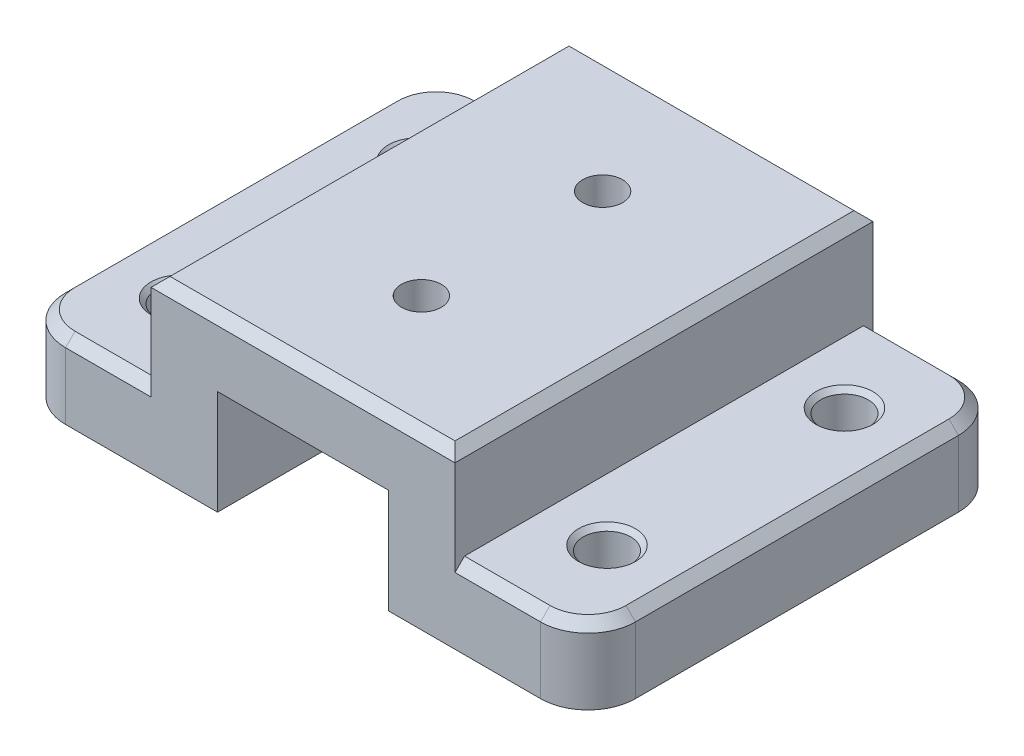
ISO-10303-21;
HEADER;
FILE_DESCRIPTION(('STEP AP214'),'2;1');
FILE_NAME('part.step','',(''),(''),'','','');
FILE_SCHEMA(('AUTOMOTIVE_DESIGN { 1 0 10303 214 1 1 1 1 }'));
ENDSEC;
DATA;
#1=APPLICATION_CONTEXT('core data for automotive mechanical design processes');
#2=APPLICATION_PROTOCOL_DEFINITION('international standard','automotive_design',2000,#1);
#3=PRODUCT_CONTEXT('',#1,'mechanical');
#4=PRODUCT('Part','Part','',(#3));
#5=PRODUCT_RELATED_PRODUCT_CATEGORY('part','',(#4));
#6=PRODUCT_DEFINITION_FORMATION('','',#4);
#7=PRODUCT_DEFINITION_CONTEXT('part definition',#1,'design');
#8=PRODUCT_DEFINITION('design','',#6,#7);
#9=PRODUCT_DEFINITION_SHAPE('','',#8);
#10=(LENGTH_UNIT() NAMED_UNIT(*) SI_UNIT(.MILLI.,.METRE.));
#11=(NAMED_UNIT(*) PLANE_ANGLE_UNIT() SI_UNIT($,.RADIAN.));
#12=(NAMED_UNIT(*) SI_UNIT($,.STERADIAN.) SOLID_ANGLE_UNIT());
#13=UNCERTAINTY_MEASURE_WITH_UNIT(LENGTH_MEASURE(1.E-05),#10,'distance_accuracy_value','');
#14=(GEOMETRIC_REPRESENTATION_CONTEXT(3) GLOBAL_UNCERTAINTY_ASSIGNED_CONTEXT((#13)) GLOBAL_UNIT_ASSIGNED_CONTEXT((#10,
#11,#12)) REPRESENTATION_CONTEXT('',''));
#15=CARTESIAN_POINT('',(0.,0.,0.));
#16=DIRECTION('',(0.,0.,1.));
#17=DIRECTION('',(1.,0.,0.));
#18=AXIS2_PLACEMENT_3D('',#15,#16,#17);
#19=CARTESIAN_POINT('',(-9.,11.,-22.));
#20=DIRECTION('',(1.,0.,0.));
#21=DIRECTION('',(0.,0.,-1.));
#22=AXIS2_PLACEMENT_3D('',#19,#20,#21);
#23=PLANE('',#22);
#24=DIRECTION('',(0.,1.,0.));
#25=VECTOR('',#24,1.);
#26=CARTESIAN_POINT('',(-9.,11.,22.));
#27=LINE('',#26,#25);
#28=CARTESIAN_POINT('',(-9.,0.,22.));
#29=VERTEX_POINT('',#28);
#30=CARTESIAN_POINT('',(-9.,11.,22.));
#31=VERTEX_POINT('',#30);
#32=EDGE_CURVE('E249',#29,#31,#27,.T.);
#33=ORIENTED_EDGE('',*,*,#32,.F.);
#34=DIRECTION('',(0.,0.,1.));
#35=VECTOR('',#34,1.);
#36=CARTESIAN_POINT('',(-9.,0.,-22.));
#37=LINE('',#36,#35);
#38=CARTESIAN_POINT('',(-9.,0.,-22.));
#39=VERTEX_POINT('',#38);
#40=EDGE_CURVE('E230',#39,#29,#37,.T.);
#41=ORIENTED_EDGE('',*,*,#40,.F.);
#42=DIRECTION('',(0.,1.,0.));
#43=VECTOR('',#42,1.);
#44=CARTESIAN_POINT('',(-9.,11.,-22.));
#45=LINE('',#44,#43);
#46=CARTESIAN_POINT('',(-9.,11.,-22.));
#47=VERTEX_POINT('',#46);
#48=EDGE_CURVE('E223',#39,#47,#45,.T.);
#49=ORIENTED_EDGE('',*,*,#48,.T.);
#50=DIRECTION('',(0.,0.,1.));
#51=VECTOR('',#50,1.);
#52=CARTESIAN_POINT('',(-9.,11.,-22.));
#53=LINE('',#52,#51);
#54=EDGE_CURVE('E204',#47,#31,#53,.T.);
#55=ORIENTED_EDGE('',*,*,#54,.T.);
#56=EDGE_LOOP('',(#33,#41,#49,#55));
#57=FACE_BOUND('',#56,.T.);
#58=ADVANCED_FACE('F40',(#57),#23,.T.);
#59=CARTESIAN_POINT('',(-9.,0.,-22.));
#60=DIRECTION('',(0.,-1.,0.));
#61=DIRECTION('',(1.,0.,0.));
#62=AXIS2_PLACEMENT_3D('',#59,#60,#61);
#63=PLANE('',#62);
#64=CARTESIAN_POINT('',(-22.5,0.,12.5));
#65=DIRECTION('',(0.,1.,0.));
#66=DIRECTION('',(1.,0.,0.));
#67=AXIS2_PLACEMENT_3D('',#64,#65,#66);
#68=CIRCLE('',#67,2.5);
#69=CARTESIAN_POINT('',(-20.,0.,12.5));
#70=VERTEX_POINT('',#69);
#71=EDGE_CURVE('E935',#70,#70,#68,.T.);
#72=ORIENTED_EDGE('',*,*,#71,.T.);
#73=EDGE_LOOP('',(#72));
#74=FACE_BOUND('',#73,.T.);
#75=CARTESIAN_POINT('',(-22.5,0.,-12.5));
#76=DIRECTION('',(0.,-1.,0.));
#77=DIRECTION('',(1.,0.,0.));
#78=AXIS2_PLACEMENT_3D('',#75,#76,#77);
#79=CIRCLE('',#78,2.5);
#80=CARTESIAN_POINT('',(-20.,0.,-12.5));
#81=VERTEX_POINT('',#80);
#82=EDGE_CURVE('E940',#81,#81,#79,.T.);
#83=ORIENTED_EDGE('',*,*,#82,.F.);
#84=EDGE_LOOP('',(#83));
#85=FACE_BOUND('',#84,.T.);
#86=DIRECTION('',(0.,0.,1.));
#87=VECTOR('',#86,1.);
#88=CARTESIAN_POINT('',(-30.,0.,-22.));
#89=LINE('',#88,#87);
#90=CARTESIAN_POINT('',(-30.,0.,-17.));
#91=VERTEX_POINT('',#90);
#92=CARTESIAN_POINT('',(-30.,0.,17.));
#93=VERTEX_POINT('',#92);
#94=EDGE_CURVE('E265',#91,#93,#89,.T.);
#95=ORIENTED_EDGE('',*,*,#94,.F.);
#96=CARTESIAN_POINT('',(-25.,0.,-17.));
#97=DIRECTION('',(0.,-1.,0.));
#98=DIRECTION('',(1.,0.,0.));
#99=AXIS2_PLACEMENT_3D('',#96,#97,#98);
#100=CIRCLE('',#99,5.);
#101=CARTESIAN_POINT('',(-25.,0.,-22.));
#102=VERTEX_POINT('',#101);
#103=EDGE_CURVE('E286',#91,#102,#100,.T.);
#104=ORIENTED_EDGE('',*,*,#103,.T.);
#105=DIRECTION('',(1.,0.,0.));
#106=VECTOR('',#105,1.);
#107=CARTESIAN_POINT('',(-9.,0.,-22.));
#108=LINE('',#107,#106);
#109=EDGE_CURVE('E215',#102,#39,#108,.T.);
#110=ORIENTED_EDGE('',*,*,#109,.T.);
#111=ORIENTED_EDGE('',*,*,#40,.T.);
#112=DIRECTION('',(1.,0.,0.));
#113=VECTOR('',#112,1.);
#114=CARTESIAN_POINT('',(-9.,0.,22.));
#115=LINE('',#114,#113);
#116=CARTESIAN_POINT('',(-25.,0.,22.));
#117=VERTEX_POINT('',#116);
#118=EDGE_CURVE('E231',#117,#29,#115,.T.);
#119=ORIENTED_EDGE('',*,*,#118,.F.);
#120=CARTESIAN_POINT('',(-25.,0.,17.));
#121=DIRECTION('',(0.,-1.,0.));
#122=DIRECTION('',(1.,0.,0.));
#123=AXIS2_PLACEMENT_3D('',#120,#121,#122);
#124=CIRCLE('',#123,5.);
#125=EDGE_CURVE('E284',#117,#93,#124,.T.);
#126=ORIENTED_EDGE('',*,*,#125,.T.);
#127=EDGE_LOOP('',(#95,#104,#110,#111,#119,#126));
#128=FACE_BOUND('',#127,.T.);
#129=ADVANCED_FACE('F542',(#74,#85,#128),#63,.T.);
#130=CARTESIAN_POINT('',(-30.,0.,-22.));
#131=DIRECTION('',(-1.,0.,0.));
#132=DIRECTION('',(0.,-1.,0.));
#133=AXIS2_PLACEMENT_3D('',#130,#131,#132);
#134=PLANE('',#133);
#135=DIRECTION('',(0.,-1.,0.));
#136=VECTOR('',#135,1.);
#137=CARTESIAN_POINT('',(-30.,7.99999999999999,17.));
#138=LINE('',#137,#136);
#139=CARTESIAN_POINT('',(-30.,6.99999999999999,17.));
#140=VERTEX_POINT('',#139);
#141=EDGE_CURVE('E264',#93,#140,#138,.F.);
#142=ORIENTED_EDGE('',*,*,#141,.T.);
#143=DIRECTION('',(0.,0.,-1.));
#144=VECTOR('',#143,1.);
#145=CARTESIAN_POINT('',(-30.,6.99999999999999,-22.));
#146=LINE('',#145,#144);
#147=CARTESIAN_POINT('',(-30.,6.99999999999999,-17.));
#148=VERTEX_POINT('',#147);
#149=EDGE_CURVE('E327',#140,#148,#146,.T.);
#150=ORIENTED_EDGE('',*,*,#149,.T.);
#151=DIRECTION('',(0.,-1.,0.));
#152=VECTOR('',#151,1.);
#153=CARTESIAN_POINT('',(-30.,0.,-17.));
#154=LINE('',#153,#152);
#155=EDGE_CURVE('E282',#148,#91,#154,.T.);
#156=ORIENTED_EDGE('',*,*,#155,.T.);
#157=ORIENTED_EDGE('',*,*,#94,.T.);
#158=EDGE_LOOP('',(#142,#150,#156,#157));
#159=FACE_BOUND('',#158,.T.);
#160=ADVANCED_FACE('F440',(#159),#134,.T.);
#161=CARTESIAN_POINT('',(-30.,7.99999999999999,-22.));
#162=DIRECTION('',(0.,1.,0.));
#163=DIRECTION('',(0.,0.,1.));
#164=AXIS2_PLACEMENT_3D('',#161,#162,#163);
#165=PLANE('',#164);
#166=CARTESIAN_POINT('',(-22.5,7.99999999999999,12.5));
#167=DIRECTION('',(0.,1.,0.));
#168=DIRECTION('',(0.,0.,1.));
#169=AXIS2_PLACEMENT_3D('',#166,#167,#168);
#170=CIRCLE('',#169,2.99999999999999);
#171=CARTESIAN_POINT('',(-22.5,7.99999999999999,15.5));
#172=VERTEX_POINT('',#171);
#173=EDGE_CURVE('E422',#172,#172,#170,.F.);
#174=ORIENTED_EDGE('',*,*,#173,.T.);
#175=EDGE_LOOP('',(#174));
#176=FACE_BOUND('',#175,.T.);
#177=CARTESIAN_POINT('',(-22.5,7.99999999999999,-12.5));
#178=DIRECTION('',(0.,1.,0.));
#179=DIRECTION('',(0.,0.,1.));
#180=AXIS2_PLACEMENT_3D('',#177,#178,#179);
#181=CIRCLE('',#180,3.);
#182=CARTESIAN_POINT('',(-22.5,7.99999999999999,-9.5));
#183=VERTEX_POINT('',#182);
#184=EDGE_CURVE('E419',#183,#183,#181,.F.);
#185=ORIENTED_EDGE('',*,*,#184,.T.);
#186=EDGE_LOOP('',(#185));
#187=FACE_BOUND('',#186,.T.);
#188=DIRECTION('',(0.,0.,1.));
#189=VECTOR('',#188,1.);
#190=CARTESIAN_POINT('',(-16.,7.99999999999999,-22.));
#191=LINE('',#190,#189);
#192=CARTESIAN_POINT('',(-16.,7.99999999999999,-21.));
#193=VERTEX_POINT('',#192);
#194=CARTESIAN_POINT('',(-16.,7.99999999999999,21.));
#195=VERTEX_POINT('',#194);
#196=EDGE_CURVE('E268',#193,#195,#191,.T.);
#197=ORIENTED_EDGE('',*,*,#196,.F.);
#198=DIRECTION('',(-1.,0.,0.));
#199=VECTOR('',#198,1.);
#200=CARTESIAN_POINT('',(-30.,7.99999999999999,-21.));
#201=LINE('',#200,#199);
#202=CARTESIAN_POINT('',(-25.,7.99999999999999,-21.));
#203=VERTEX_POINT('',#202);
#204=EDGE_CURVE('E314',#193,#203,#201,.T.);
#205=ORIENTED_EDGE('',*,*,#204,.T.);
#206=CARTESIAN_POINT('',(-25.,7.99999999999999,-17.));
#207=DIRECTION('',(0.,1.,0.));
#208=DIRECTION('',(0.,0.,1.));
#209=AXIS2_PLACEMENT_3D('',#206,#207,#208);
#210=CIRCLE('',#209,3.99999999999999);
#211=CARTESIAN_POINT('',(-29.,7.99999999999999,-17.));
#212=VERTEX_POINT('',#211);
#213=EDGE_CURVE('E312',#203,#212,#210,.T.);
#214=ORIENTED_EDGE('',*,*,#213,.T.);
#215=DIRECTION('',(0.,0.,1.));
#216=VECTOR('',#215,1.);
#217=CARTESIAN_POINT('',(-29.,7.99999999999999,-22.));
#218=LINE('',#217,#216);
#219=CARTESIAN_POINT('',(-29.,7.99999999999999,17.));
#220=VERTEX_POINT('',#219);
#221=EDGE_CURVE('E310',#212,#220,#218,.T.);
#222=ORIENTED_EDGE('',*,*,#221,.T.);
#223=CARTESIAN_POINT('',(-25.,7.99999999999999,17.));
#224=DIRECTION('',(0.,1.,0.));
#225=DIRECTION('',(0.,0.,1.));
#226=AXIS2_PLACEMENT_3D('',#223,#224,#225);
#227=CIRCLE('',#226,3.99999999999999);
#228=CARTESIAN_POINT('',(-25.,7.99999999999999,21.));
#229=VERTEX_POINT('',#228);
#230=EDGE_CURVE('E308',#220,#229,#227,.T.);
#231=ORIENTED_EDGE('',*,*,#230,.T.);
#232=DIRECTION('',(1.,0.,0.));
#233=VECTOR('',#232,1.);
#234=CARTESIAN_POINT('',(-16.,7.99999999999999,21.));
#235=LINE('',#234,#233);
#236=EDGE_CURVE('E306',#229,#195,#235,.T.);
#237=ORIENTED_EDGE('',*,*,#236,.T.);
#238=EDGE_LOOP('',(#197,#205,#214,#222,#231,#237));
#239=FACE_BOUND('',#238,.T.);
#240=ADVANCED_FACE('F436',(#176,#187,#239),#165,.T.);
#241=CARTESIAN_POINT('',(-16.,7.99999999999999,-22.));
#242=DIRECTION('',(-1.,0.,0.));
#243=DIRECTION('',(0.,0.,1.));
#244=AXIS2_PLACEMENT_3D('',#241,#242,#243);
#245=PLANE('',#244);
#246=DIRECTION('',(0.,-1.,0.));
#247=VECTOR('',#246,1.);
#248=CARTESIAN_POINT('',(-16.,7.99999999999999,22.));
#249=LINE('',#248,#247);
#250=CARTESIAN_POINT('',(-16.,17.,22.));
#251=VERTEX_POINT('',#250);
#252=CARTESIAN_POINT('',(-16.,6.99999999999999,22.));
#253=VERTEX_POINT('',#252);
#254=EDGE_CURVE('E233',#251,#253,#249,.T.);
#255=ORIENTED_EDGE('',*,*,#254,.F.);
#256=DIRECTION('',(0.,0.,-1.));
#257=VECTOR('',#256,1.);
#258=CARTESIAN_POINT('',(-16.,17.,-22.));
#259=LINE('',#258,#257);
#260=CARTESIAN_POINT('',(-16.,17.,-22.));
#261=VERTEX_POINT('',#260);
#262=EDGE_CURVE('E362',#251,#261,#259,.T.);
#263=ORIENTED_EDGE('',*,*,#262,.T.);
#264=DIRECTION('',(0.,-1.,0.));
#265=VECTOR('',#264,1.);
#266=CARTESIAN_POINT('',(-16.,7.99999999999999,-22.));
#267=LINE('',#266,#265);
#268=CARTESIAN_POINT('',(-16.,6.99999999999999,-22.));
#269=VERTEX_POINT('',#268);
#270=EDGE_CURVE('E246',#261,#269,#267,.T.);
#271=ORIENTED_EDGE('',*,*,#270,.T.);
#272=DIRECTION('',(0.,-0.707106781186545,-0.70710678118655));
#273=VECTOR('',#272,1.);
#274=CARTESIAN_POINT('',(-16.,7.99999999999999,-21.));
#275=LINE('',#274,#273);
#276=EDGE_CURVE('E366',#269,#193,#275,.F.);
#277=ORIENTED_EDGE('',*,*,#276,.T.);
#278=ORIENTED_EDGE('',*,*,#196,.T.);
#279=DIRECTION('',(0.,-0.707106781186545,0.70710678118655));
#280=VECTOR('',#279,1.);
#281=CARTESIAN_POINT('',(-16.,6.99999999999999,22.));
#282=LINE('',#281,#280);
#283=EDGE_CURVE('E368',#195,#253,#282,.T.);
#284=ORIENTED_EDGE('',*,*,#283,.T.);
#285=EDGE_LOOP('',(#255,#263,#271,#277,#278,#284));
#286=FACE_BOUND('',#285,.T.);
#287=ADVANCED_FACE('F439',(#286),#245,.T.);
#288=CARTESIAN_POINT('',(-16.,18.,-22.));
#289=DIRECTION('',(0.,1.,0.));
#290=DIRECTION('',(-1.,0.,0.));
#291=AXIS2_PLACEMENT_3D('',#288,#289,#290);
#292=PLANE('',#291);
#293=CARTESIAN_POINT('',(0.,18.,9.54006420562289));
#294=DIRECTION('',(0.,1.,0.));
#295=DIRECTION('',(0.,0.,1.));
#296=AXIS2_PLACEMENT_3D('',#293,#294,#295);
#297=CIRCLE('',#296,2.1);
#298=CARTESIAN_POINT('',(0.,18.,11.6400642056229));
#299=VERTEX_POINT('',#298);
#300=EDGE_CURVE('E925',#299,#299,#297,.T.);
#301=ORIENTED_EDGE('',*,*,#300,.F.);
#302=EDGE_LOOP('',(#301));
#303=FACE_BOUND('',#302,.T.);
#304=CARTESIAN_POINT('',(0.,18.,-9.54006420562289));
#305=DIRECTION('',(0.,1.,0.));
#306=DIRECTION('',(0.,0.,1.));
#307=AXIS2_PLACEMENT_3D('',#304,#305,#306);
#308=CIRCLE('',#307,2.1);
#309=CARTESIAN_POINT('',(0.,18.,-7.44006420562289));
#310=VERTEX_POINT('',#309);
#311=EDGE_CURVE('E927',#310,#310,#308,.T.);
#312=ORIENTED_EDGE('',*,*,#311,.F.);
#313=EDGE_LOOP('',(#312));
#314=FACE_BOUND('',#313,.T.);
#315=DIRECTION('',(0.,0.,-1.));
#316=VECTOR('',#315,1.);
#317=CARTESIAN_POINT('',(15.,18.,-22.));
#318=LINE('',#317,#316);
#319=CARTESIAN_POINT('',(15.,18.,21.));
#320=VERTEX_POINT('',#319);
#321=CARTESIAN_POINT('',(15.,18.,-21.));
#322=VERTEX_POINT('',#321);
#323=EDGE_CURVE('E355',#320,#322,#318,.T.);
#324=ORIENTED_EDGE('',*,*,#323,.T.);
#325=DIRECTION('',(-1.,0.,0.));
#326=VECTOR('',#325,1.);
#327=CARTESIAN_POINT('',(-16.,18.,-21.));
#328=LINE('',#327,#326);
#329=CARTESIAN_POINT('',(-15.,18.,-21.));
#330=VERTEX_POINT('',#329);
#331=EDGE_CURVE('E360',#322,#330,#328,.T.);
#332=ORIENTED_EDGE('',*,*,#331,.T.);
#333=DIRECTION('',(0.,0.,1.));
#334=VECTOR('',#333,1.);
#335=CARTESIAN_POINT('',(-15.,18.,-22.));
#336=LINE('',#335,#334);
#337=CARTESIAN_POINT('',(-15.,18.,21.));
#338=VERTEX_POINT('',#337);
#339=EDGE_CURVE('E63',#330,#338,#336,.T.);
#340=ORIENTED_EDGE('',*,*,#339,.T.);
#341=DIRECTION('',(1.,0.,0.));
#342=VECTOR('',#341,1.);
#343=CARTESIAN_POINT('',(16.,18.,21.));
#344=LINE('',#343,#342);
#345=EDGE_CURVE('E357',#338,#320,#344,.T.);
#346=ORIENTED_EDGE('',*,*,#345,.T.);
#347=EDGE_LOOP('',(#324,#332,#340,#346));
#348=FACE_BOUND('',#347,.T.);
#349=ADVANCED_FACE('F482',(#303,#314,#348),#292,.T.);
#350=CARTESIAN_POINT('',(16.,8.,-22.));
#351=DIRECTION('',(1.,0.,0.));
#352=DIRECTION('',(0.,0.,-1.));
#353=AXIS2_PLACEMENT_3D('',#350,#351,#352);
#354=PLANE('',#353);
#355=DIRECTION('',(0.,1.,0.));
#356=VECTOR('',#355,1.);
#357=CARTESIAN_POINT('',(16.,8.,-22.));
#358=LINE('',#357,#356);
#359=CARTESIAN_POINT('',(16.,6.99999999999999,-22.));
#360=VERTEX_POINT('',#359);
#361=CARTESIAN_POINT('',(16.,17.,-22.));
#362=VERTEX_POINT('',#361);
#363=EDGE_CURVE('E243',#360,#362,#358,.T.);
#364=ORIENTED_EDGE('',*,*,#363,.T.);
#365=DIRECTION('',(0.,0.,1.));
#366=VECTOR('',#365,1.);
#367=CARTESIAN_POINT('',(16.,17.,-22.));
#368=LINE('',#367,#366);
#369=CARTESIAN_POINT('',(16.,17.,22.));
#370=VERTEX_POINT('',#369);
#371=EDGE_CURVE('E364',#362,#370,#368,.T.);
#372=ORIENTED_EDGE('',*,*,#371,.T.);
#373=DIRECTION('',(0.,1.,0.));
#374=VECTOR('',#373,1.);
#375=CARTESIAN_POINT('',(16.,8.,22.));
#376=LINE('',#375,#374);
#377=CARTESIAN_POINT('',(16.,7.,22.));
#378=VERTEX_POINT('',#377);
#379=EDGE_CURVE('E259',#378,#370,#376,.T.);
#380=ORIENTED_EDGE('',*,*,#379,.F.);
#381=DIRECTION('',(0.,0.707106781186545,-0.70710678118655));
#382=VECTOR('',#381,1.);
#383=CARTESIAN_POINT('',(16.,6.99999999999999,22.));
#384=LINE('',#383,#382);
#385=CARTESIAN_POINT('',(16.,8.,21.));
#386=VERTEX_POINT('',#385);
#387=EDGE_CURVE('E374',#378,#386,#384,.T.);
#388=ORIENTED_EDGE('',*,*,#387,.T.);
#389=DIRECTION('',(0.,0.,1.));
#390=VECTOR('',#389,1.);
#391=CARTESIAN_POINT('',(16.,8.,-22.));
#392=LINE('',#391,#390);
#393=CARTESIAN_POINT('',(16.,8.,-21.));
#394=VERTEX_POINT('',#393);
#395=EDGE_CURVE('E271',#394,#386,#392,.T.);
#396=ORIENTED_EDGE('',*,*,#395,.F.);
#397=DIRECTION('',(0.,0.707106781186545,0.70710678118655));
#398=VECTOR('',#397,1.);
#399=CARTESIAN_POINT('',(16.,8.,-21.));
#400=LINE('',#399,#398);
#401=EDGE_CURVE('E371',#394,#360,#400,.F.);
#402=ORIENTED_EDGE('',*,*,#401,.T.);
#403=EDGE_LOOP('',(#364,#372,#380,#388,#396,#402));
#404=FACE_BOUND('',#403,.T.);
#405=ADVANCED_FACE('F490',(#404),#354,.T.);
#406=CARTESIAN_POINT('',(30.,8.,-22.));
#407=DIRECTION('',(0.,1.,0.));
#408=DIRECTION('',(-1.,0.,0.));
#409=AXIS2_PLACEMENT_3D('',#406,#407,#408);
#410=PLANE('',#409);
#411=CARTESIAN_POINT('',(22.5,8.,12.5));
#412=DIRECTION('',(0.,1.,0.));
#413=DIRECTION('',(-1.,0.,0.));
#414=AXIS2_PLACEMENT_3D('',#411,#412,#413);
#415=CIRCLE('',#414,2.99999999999999);
#416=CARTESIAN_POINT('',(19.5,8.,12.5));
#417=VERTEX_POINT('',#416);
#418=EDGE_CURVE('E410',#417,#417,#415,.F.);
#419=ORIENTED_EDGE('',*,*,#418,.T.);
#420=EDGE_LOOP('',(#419));
#421=FACE_BOUND('',#420,.T.);
#422=CARTESIAN_POINT('',(22.5,8.,-12.5));
#423=DIRECTION('',(0.,1.,0.));
#424=DIRECTION('',(-1.,0.,0.));
#425=AXIS2_PLACEMENT_3D('',#422,#423,#424);
#426=CIRCLE('',#425,3.00000000000001);
#427=CARTESIAN_POINT('',(19.5,8.,-12.5));
#428=VERTEX_POINT('',#427);
#429=EDGE_CURVE('E376',#428,#428,#426,.F.);
#430=ORIENTED_EDGE('',*,*,#429,.T.);
#431=EDGE_LOOP('',(#430));
#432=FACE_BOUND('',#431,.T.);
#433=CARTESIAN_POINT('',(25.,8.,-17.));
#434=DIRECTION('',(0.,1.,0.));
#435=DIRECTION('',(-1.,0.,0.));
#436=AXIS2_PLACEMENT_3D('',#433,#434,#435);
#437=CIRCLE('',#436,3.99999999999999);
#438=CARTESIAN_POINT('',(29.,8.,-17.));
#439=VERTEX_POINT('',#438);
#440=CARTESIAN_POINT('',(25.,8.,-21.));
#441=VERTEX_POINT('',#440);
#442=EDGE_CURVE('E344',#439,#441,#437,.T.);
#443=ORIENTED_EDGE('',*,*,#442,.T.);
#444=DIRECTION('',(-1.,0.,0.));
#445=VECTOR('',#444,1.);
#446=CARTESIAN_POINT('',(30.,8.,-21.));
#447=LINE('',#446,#445);
#448=EDGE_CURVE('E346',#441,#394,#447,.T.);
#449=ORIENTED_EDGE('',*,*,#448,.T.);
#450=ORIENTED_EDGE('',*,*,#395,.T.);
#451=DIRECTION('',(1.,0.,0.));
#452=VECTOR('',#451,1.);
#453=CARTESIAN_POINT('',(25.,8.,21.));
#454=LINE('',#453,#452);
#455=CARTESIAN_POINT('',(25.,8.,21.));
#456=VERTEX_POINT('',#455);
#457=EDGE_CURVE('E338',#386,#456,#454,.T.);
#458=ORIENTED_EDGE('',*,*,#457,.T.);
#459=CARTESIAN_POINT('',(25.,8.,17.));
#460=DIRECTION('',(0.,1.,0.));
#461=DIRECTION('',(-1.,0.,0.));
#462=AXIS2_PLACEMENT_3D('',#459,#460,#461);
#463=CIRCLE('',#462,3.99999999999999);
#464=CARTESIAN_POINT('',(29.,8.,17.));
#465=VERTEX_POINT('',#464);
#466=EDGE_CURVE('E340',#456,#465,#463,.T.);
#467=ORIENTED_EDGE('',*,*,#466,.T.);
#468=DIRECTION('',(0.,0.,-1.));
#469=VECTOR('',#468,1.);
#470=CARTESIAN_POINT('',(29.,8.,-22.));
#471=LINE('',#470,#469);
#472=EDGE_CURVE('E342',#465,#439,#471,.T.);
#473=ORIENTED_EDGE('',*,*,#472,.T.);
#474=EDGE_LOOP('',(#443,#449,#450,#458,#467,#473));
#475=FACE_BOUND('',#474,.T.);
#476=ADVANCED_FACE('F734',(#421,#432,#475),#410,.T.);
#477=CARTESIAN_POINT('',(30.,0.,-22.));
#478=DIRECTION('',(1.,0.,0.));
#479=DIRECTION('',(0.,1.,0.));
#480=AXIS2_PLACEMENT_3D('',#477,#478,#479);
#481=PLANE('',#480);
#482=DIRECTION('',(0.,1.,0.));
#483=VECTOR('',#482,1.);
#484=CARTESIAN_POINT('',(30.,0.,-17.));
#485=LINE('',#484,#483);
#486=CARTESIAN_POINT('',(30.,0.,-17.));
#487=VERTEX_POINT('',#486);
#488=CARTESIAN_POINT('',(30.,7.,-17.));
#489=VERTEX_POINT('',#488);
#490=EDGE_CURVE('E294',#487,#489,#485,.T.);
#491=ORIENTED_EDGE('',*,*,#490,.T.);
#492=DIRECTION('',(0.,0.,1.));
#493=VECTOR('',#492,1.);
#494=CARTESIAN_POINT('',(30.,7.,-22.));
#495=LINE('',#494,#493);
#496=CARTESIAN_POINT('',(30.,7.,17.));
#497=VERTEX_POINT('',#496);
#498=EDGE_CURVE('E351',#489,#497,#495,.T.);
#499=ORIENTED_EDGE('',*,*,#498,.T.);
#500=DIRECTION('',(0.,1.,0.));
#501=VECTOR('',#500,1.);
#502=CARTESIAN_POINT('',(30.,0.,17.));
#503=LINE('',#502,#501);
#504=CARTESIAN_POINT('',(30.,0.,17.));
#505=VERTEX_POINT('',#504);
#506=EDGE_CURVE('E292',#497,#505,#503,.F.);
#507=ORIENTED_EDGE('',*,*,#506,.T.);
#508=DIRECTION('',(0.,0.,1.));
#509=VECTOR('',#508,1.);
#510=CARTESIAN_POINT('',(30.,0.,-22.));
#511=LINE('',#510,#509);
#512=EDGE_CURVE('E274',#487,#505,#511,.T.);
#513=ORIENTED_EDGE('',*,*,#512,.F.);
#514=EDGE_LOOP('',(#491,#499,#507,#513));
#515=FACE_BOUND('',#514,.T.);
#516=ADVANCED_FACE('F514',(#515),#481,.T.);
#517=CARTESIAN_POINT('',(9.,0.,-22.));
#518=DIRECTION('',(0.,-1.,0.));
#519=DIRECTION('',(1.,0.,0.));
#520=AXIS2_PLACEMENT_3D('',#517,#518,#519);
#521=PLANE('',#520);
#522=CARTESIAN_POINT('',(22.5,0.,12.5));
#523=DIRECTION('',(0.,-1.,0.));
#524=DIRECTION('',(-1.,0.,0.));
#525=AXIS2_PLACEMENT_3D('',#522,#523,#524);
#526=CIRCLE('',#525,2.5);
#527=CARTESIAN_POINT('',(20.,0.,12.5));
#528=VERTEX_POINT('',#527);
#529=EDGE_CURVE('E938',#528,#528,#526,.T.);
#530=ORIENTED_EDGE('',*,*,#529,.F.);
#531=EDGE_LOOP('',(#530));
#532=FACE_BOUND('',#531,.T.);
#533=CARTESIAN_POINT('',(22.5,0.,-12.5));
#534=DIRECTION('',(0.,1.,0.));
#535=DIRECTION('',(-1.,0.,0.));
#536=AXIS2_PLACEMENT_3D('',#533,#534,#535);
#537=CIRCLE('',#536,2.5);
#538=CARTESIAN_POINT('',(20.,0.,-12.5));
#539=VERTEX_POINT('',#538);
#540=EDGE_CURVE('E236',#539,#539,#537,.T.);
#541=ORIENTED_EDGE('',*,*,#540,.T.);
#542=EDGE_LOOP('',(#541));
#543=FACE_BOUND('',#542,.T.);
#544=DIRECTION('',(1.,0.,0.));
#545=VECTOR('',#544,1.);
#546=CARTESIAN_POINT('',(9.,0.,-22.));
#547=LINE('',#546,#545);
#548=CARTESIAN_POINT('',(9.,0.,-22.));
#549=VERTEX_POINT('',#548);
#550=CARTESIAN_POINT('',(25.,0.,-22.));
#551=VERTEX_POINT('',#550);
#552=EDGE_CURVE('E240',#549,#551,#547,.T.);
#553=ORIENTED_EDGE('',*,*,#552,.T.);
#554=CARTESIAN_POINT('',(25.,0.,-17.));
#555=DIRECTION('',(0.,-1.,0.));
#556=DIRECTION('',(1.,0.,0.));
#557=AXIS2_PLACEMENT_3D('',#554,#555,#556);
#558=CIRCLE('',#557,5.);
#559=EDGE_CURVE('E299',#551,#487,#558,.T.);
#560=ORIENTED_EDGE('',*,*,#559,.T.);
#561=ORIENTED_EDGE('',*,*,#512,.T.);
#562=CARTESIAN_POINT('',(25.,0.,17.));
#563=DIRECTION('',(0.,-1.,0.));
#564=DIRECTION('',(1.,0.,0.));
#565=AXIS2_PLACEMENT_3D('',#562,#563,#564);
#566=CIRCLE('',#565,5.);
#567=CARTESIAN_POINT('',(25.,0.,22.));
#568=VERTEX_POINT('',#567);
#569=EDGE_CURVE('E297',#505,#568,#566,.T.);
#570=ORIENTED_EDGE('',*,*,#569,.T.);
#571=DIRECTION('',(1.,0.,0.));
#572=VECTOR('',#571,1.);
#573=CARTESIAN_POINT('',(9.,0.,22.));
#574=LINE('',#573,#572);
#575=CARTESIAN_POINT('',(9.,0.,22.));
#576=VERTEX_POINT('',#575);
#577=EDGE_CURVE('E256',#576,#568,#574,.T.);
#578=ORIENTED_EDGE('',*,*,#577,.F.);
#579=DIRECTION('',(0.,0.,1.));
#580=VECTOR('',#579,1.);
#581=CARTESIAN_POINT('',(9.,0.,-22.));
#582=LINE('',#581,#580);
#583=EDGE_CURVE('E277',#549,#576,#582,.T.);
#584=ORIENTED_EDGE('',*,*,#583,.F.);
#585=EDGE_LOOP('',(#553,#560,#561,#570,#578,#584));
#586=FACE_BOUND('',#585,.T.);
#587=ADVANCED_FACE('F534',(#532,#543,#586),#521,.T.);
#588=CARTESIAN_POINT('',(9.,11.,-22.));
#589=DIRECTION('',(-1.,0.,0.));
#590=DIRECTION('',(0.,-1.,0.));
#591=AXIS2_PLACEMENT_3D('',#588,#589,#590);
#592=PLANE('',#591);
#593=DIRECTION('',(0.,-1.,0.));
#594=VECTOR('',#593,1.);
#595=CARTESIAN_POINT('',(9.,11.,22.));
#596=LINE('',#595,#594);
#597=CARTESIAN_POINT('',(9.,11.,22.));
#598=VERTEX_POINT('',#597);
#599=EDGE_CURVE('E253',#598,#576,#596,.T.);
#600=ORIENTED_EDGE('',*,*,#599,.F.);
#601=DIRECTION('',(0.,0.,1.));
#602=VECTOR('',#601,1.);
#603=CARTESIAN_POINT('',(9.,11.,-22.));
#604=LINE('',#603,#602);
#605=CARTESIAN_POINT('',(9.,11.,-22.));
#606=VERTEX_POINT('',#605);
#607=EDGE_CURVE('E214',#606,#598,#604,.T.);
#608=ORIENTED_EDGE('',*,*,#607,.F.);
#609=DIRECTION('',(0.,-1.,0.));
#610=VECTOR('',#609,1.);
#611=CARTESIAN_POINT('',(9.,11.,-22.));
#612=LINE('',#611,#610);
#613=EDGE_CURVE('E226',#606,#549,#612,.T.);
#614=ORIENTED_EDGE('',*,*,#613,.T.);
#615=ORIENTED_EDGE('',*,*,#583,.T.);
#616=EDGE_LOOP('',(#600,#608,#614,#615));
#617=FACE_BOUND('',#616,.T.);
#618=ADVANCED_FACE('F536',(#617),#592,.T.);
#619=CARTESIAN_POINT('',(9.,11.,-22.));
#620=DIRECTION('',(0.,-1.,0.));
#621=DIRECTION('',(1.,0.,0.));
#622=AXIS2_PLACEMENT_3D('',#619,#620,#621);
#623=PLANE('',#622);
#624=CARTESIAN_POINT('',(0.,11.,9.54006420562289));
#625=DIRECTION('',(0.,-1.,0.));
#626=DIRECTION('',(1.,0.,0.));
#627=AXIS2_PLACEMENT_3D('',#624,#625,#626);
#628=CIRCLE('',#627,2.1);
#629=CARTESIAN_POINT('',(2.1,11.,9.54006420562289));
#630=VERTEX_POINT('',#629);
#631=EDGE_CURVE('E922',#630,#630,#628,.T.);
#632=ORIENTED_EDGE('',*,*,#631,.F.);
#633=EDGE_LOOP('',(#632));
#634=FACE_BOUND('',#633,.T.);
#635=CARTESIAN_POINT('',(0.,11.,-9.54006420562289));
#636=DIRECTION('',(0.,-1.,0.));
#637=DIRECTION('',(1.,0.,0.));
#638=AXIS2_PLACEMENT_3D('',#635,#636,#637);
#639=CIRCLE('',#638,2.1);
#640=CARTESIAN_POINT('',(2.1,11.,-9.54006420562289));
#641=VERTEX_POINT('',#640);
#642=EDGE_CURVE('E932',#641,#641,#639,.T.);
#643=ORIENTED_EDGE('',*,*,#642,.F.);
#644=EDGE_LOOP('',(#643));
#645=FACE_BOUND('',#644,.T.);
#646=DIRECTION('',(1.,0.,0.));
#647=VECTOR('',#646,1.);
#648=CARTESIAN_POINT('',(9.,11.,22.));
#649=LINE('',#648,#647);
#650=EDGE_CURVE('E209',#31,#598,#649,.T.);
#651=ORIENTED_EDGE('',*,*,#650,.F.);
#652=ORIENTED_EDGE('',*,*,#54,.F.);
#653=DIRECTION('',(1.,0.,0.));
#654=VECTOR('',#653,1.);
#655=CARTESIAN_POINT('',(9.,11.,-22.));
#656=LINE('',#655,#654);
#657=EDGE_CURVE('E207',#47,#606,#656,.T.);
#658=ORIENTED_EDGE('',*,*,#657,.T.);
#659=ORIENTED_EDGE('',*,*,#607,.T.);
#660=EDGE_LOOP('',(#651,#652,#658,#659));
#661=FACE_BOUND('',#660,.T.);
#662=ADVANCED_FACE('F206',(#634,#645,#661),#623,.T.);
#663=CARTESIAN_POINT('',(0.,0.,-22.));
#664=DIRECTION('',(0.,0.,-1.));
#665=DIRECTION('',(-1.,0.,0.));
#666=AXIS2_PLACEMENT_3D('',#663,#664,#665);
#667=PLANE('',#666);
#668=DIRECTION('',(0.,-1.,0.));
#669=VECTOR('',#668,1.);
#670=CARTESIAN_POINT('',(-25.,0.,-22.));
#671=LINE('',#670,#669);
#672=CARTESIAN_POINT('',(-25.,6.99999999999999,-22.));
#673=VERTEX_POINT('',#672);
#674=EDGE_CURVE('E290',#102,#673,#671,.F.);
#675=ORIENTED_EDGE('',*,*,#674,.T.);
#676=DIRECTION('',(1.,0.,0.));
#677=VECTOR('',#676,1.);
#678=CARTESIAN_POINT('',(0.,6.99999999999999,-22.));
#679=LINE('',#678,#677);
#680=EDGE_CURVE('E322',#673,#269,#679,.T.);
#681=ORIENTED_EDGE('',*,*,#680,.T.);
#682=ORIENTED_EDGE('',*,*,#270,.F.);
#683=DIRECTION('',(1.,0.,0.));
#684=VECTOR('',#683,1.);
#685=CARTESIAN_POINT('',(0.,17.,-22.));
#686=LINE('',#685,#684);
#687=EDGE_CURVE('E317',#261,#362,#686,.T.);
#688=ORIENTED_EDGE('',*,*,#687,.T.);
#689=ORIENTED_EDGE('',*,*,#363,.F.);
#690=DIRECTION('',(1.,0.,0.));
#691=VECTOR('',#690,1.);
#692=CARTESIAN_POINT('',(0.,6.99999999999999,-22.));
#693=LINE('',#692,#691);
#694=CARTESIAN_POINT('',(25.,7.,-22.));
#695=VERTEX_POINT('',#694);
#696=EDGE_CURVE('E320',#360,#695,#693,.T.);
#697=ORIENTED_EDGE('',*,*,#696,.T.);
#698=DIRECTION('',(0.,1.,0.));
#699=VECTOR('',#698,1.);
#700=CARTESIAN_POINT('',(25.,0.,-22.));
#701=LINE('',#700,#699);
#702=EDGE_CURVE('E288',#695,#551,#701,.F.);
#703=ORIENTED_EDGE('',*,*,#702,.T.);
#704=ORIENTED_EDGE('',*,*,#552,.F.);
#705=ORIENTED_EDGE('',*,*,#613,.F.);
#706=ORIENTED_EDGE('',*,*,#657,.F.);
#707=ORIENTED_EDGE('',*,*,#48,.F.);
#708=ORIENTED_EDGE('',*,*,#109,.F.);
#709=EDGE_LOOP('',(#675,#681,#682,#688,#689,#697,#703,#704,#705,#706,#707,#708));
#710=FACE_BOUND('',#709,.T.);
#711=ADVANCED_FACE('F221',(#710),#667,.T.);
#712=CARTESIAN_POINT('',(0.,0.,22.));
#713=DIRECTION('',(0.,0.,-1.));
#714=DIRECTION('',(-1.,0.,0.));
#715=AXIS2_PLACEMENT_3D('',#712,#713,#714);
#716=PLANE('',#715);
#717=ORIENTED_EDGE('',*,*,#254,.T.);
#718=DIRECTION('',(-1.,0.,0.));
#719=VECTOR('',#718,1.);
#720=CARTESIAN_POINT('',(-25.,6.99999999999999,22.));
#721=LINE('',#720,#719);
#722=CARTESIAN_POINT('',(-25.,6.99999999999999,22.));
#723=VERTEX_POINT('',#722);
#724=EDGE_CURVE('E336',#253,#723,#721,.T.);
#725=ORIENTED_EDGE('',*,*,#724,.T.);
#726=DIRECTION('',(0.,-1.,0.));
#727=VECTOR('',#726,1.);
#728=CARTESIAN_POINT('',(-25.,0.,22.));
#729=LINE('',#728,#727);
#730=EDGE_CURVE('E301',#723,#117,#729,.T.);
#731=ORIENTED_EDGE('',*,*,#730,.T.);
#732=ORIENTED_EDGE('',*,*,#118,.T.);
#733=ORIENTED_EDGE('',*,*,#32,.T.);
#734=ORIENTED_EDGE('',*,*,#650,.T.);
#735=ORIENTED_EDGE('',*,*,#599,.T.);
#736=ORIENTED_EDGE('',*,*,#577,.T.);
#737=DIRECTION('',(0.,1.,0.));
#738=VECTOR('',#737,1.);
#739=CARTESIAN_POINT('',(25.,8.,22.));
#740=LINE('',#739,#738);
#741=CARTESIAN_POINT('',(25.,7.,22.));
#742=VERTEX_POINT('',#741);
#743=EDGE_CURVE('E303',#568,#742,#740,.T.);
#744=ORIENTED_EDGE('',*,*,#743,.T.);
#745=DIRECTION('',(-1.,0.,0.));
#746=VECTOR('',#745,1.);
#747=CARTESIAN_POINT('',(16.,7.,22.));
#748=LINE('',#747,#746);
#749=EDGE_CURVE('E333',#742,#378,#748,.T.);
#750=ORIENTED_EDGE('',*,*,#749,.T.);
#751=ORIENTED_EDGE('',*,*,#379,.T.);
#752=DIRECTION('',(-1.,0.,0.));
#753=VECTOR('',#752,1.);
#754=CARTESIAN_POINT('',(-16.,17.,22.));
#755=LINE('',#754,#753);
#756=EDGE_CURVE('E331',#370,#251,#755,.T.);
#757=ORIENTED_EDGE('',*,*,#756,.T.);
#758=EDGE_LOOP('',(#717,#725,#731,#732,#733,#734,#735,#736,#744,#750,#751,#757));
#759=FACE_BOUND('',#758,.T.);
#760=ADVANCED_FACE('F530',(#759),#716,.F.);
#761=CARTESIAN_POINT('',(-25.,0.,-17.));
#762=DIRECTION('',(0.,-1.,0.));
#763=DIRECTION('',(1.,0.,0.));
#764=AXIS2_PLACEMENT_3D('',#761,#762,#763);
#765=CYLINDRICAL_SURFACE('',#764,5.);
#766=ORIENTED_EDGE('',*,*,#155,.F.);
#767=CARTESIAN_POINT('',(-25.,6.99999999999999,-17.));
#768=DIRECTION('',(0.,1.,0.));
#769=DIRECTION('',(0.,0.,1.));
#770=AXIS2_PLACEMENT_3D('',#767,#768,#769);
#771=CIRCLE('',#770,5.);
#772=EDGE_CURVE('E325',#148,#673,#771,.F.);
#773=ORIENTED_EDGE('',*,*,#772,.T.);
#774=ORIENTED_EDGE('',*,*,#674,.F.);
#775=ORIENTED_EDGE('',*,*,#103,.F.);
#776=EDGE_LOOP('',(#766,#773,#774,#775));
#777=FACE_BOUND('',#776,.T.);
#778=ADVANCED_FACE('F547',(#777),#765,.T.);
#779=CARTESIAN_POINT('',(25.,0.,-17.));
#780=DIRECTION('',(0.,1.,0.));
#781=DIRECTION('',(-1.,0.,0.));
#782=AXIS2_PLACEMENT_3D('',#779,#780,#781);
#783=CYLINDRICAL_SURFACE('',#782,5.);
#784=ORIENTED_EDGE('',*,*,#702,.F.);
#785=CARTESIAN_POINT('',(25.,7.,-17.));
#786=DIRECTION('',(0.,1.,0.));
#787=DIRECTION('',(0.,0.,1.));
#788=AXIS2_PLACEMENT_3D('',#785,#786,#787);
#789=CIRCLE('',#788,5.);
#790=EDGE_CURVE('E349',#695,#489,#789,.F.);
#791=ORIENTED_EDGE('',*,*,#790,.T.);
#792=ORIENTED_EDGE('',*,*,#490,.F.);
#793=ORIENTED_EDGE('',*,*,#559,.F.);
#794=EDGE_LOOP('',(#784,#791,#792,#793));
#795=FACE_BOUND('',#794,.T.);
#796=ADVANCED_FACE('F501',(#795),#783,.T.);
#797=CARTESIAN_POINT('',(25.,0.,17.));
#798=DIRECTION('',(0.,-1.,0.));
#799=DIRECTION('',(1.,0.,0.));
#800=AXIS2_PLACEMENT_3D('',#797,#798,#799);
#801=CYLINDRICAL_SURFACE('',#800,5.);
#802=ORIENTED_EDGE('',*,*,#506,.F.);
#803=CARTESIAN_POINT('',(25.,7.,17.));
#804=DIRECTION('',(0.,1.,0.));
#805=DIRECTION('',(0.,0.,1.));
#806=AXIS2_PLACEMENT_3D('',#803,#804,#805);
#807=CIRCLE('',#806,5.);
#808=EDGE_CURVE('E353',#497,#742,#807,.F.);
#809=ORIENTED_EDGE('',*,*,#808,.T.);
#810=ORIENTED_EDGE('',*,*,#743,.F.);
#811=ORIENTED_EDGE('',*,*,#569,.F.);
#812=EDGE_LOOP('',(#802,#809,#810,#811));
#813=FACE_BOUND('',#812,.T.);
#814=ADVANCED_FACE('F519',(#813),#801,.T.);
#815=CARTESIAN_POINT('',(-25.,0.,17.));
#816=DIRECTION('',(0.,1.,0.));
#817=DIRECTION('',(-1.,0.,0.));
#818=AXIS2_PLACEMENT_3D('',#815,#816,#817);
#819=CYLINDRICAL_SURFACE('',#818,5.);
#820=ORIENTED_EDGE('',*,*,#730,.F.);
#821=CARTESIAN_POINT('',(-25.,6.99999999999999,17.));
#822=DIRECTION('',(0.,1.,0.));
#823=DIRECTION('',(0.,0.,1.));
#824=AXIS2_PLACEMENT_3D('',#821,#822,#823);
#825=CIRCLE('',#824,5.);
#826=EDGE_CURVE('E329',#723,#140,#825,.F.);
#827=ORIENTED_EDGE('',*,*,#826,.T.);
#828=ORIENTED_EDGE('',*,*,#141,.F.);
#829=ORIENTED_EDGE('',*,*,#125,.F.);
#830=EDGE_LOOP('',(#820,#827,#828,#829));
#831=FACE_BOUND('',#830,.T.);
#832=ADVANCED_FACE('F551',(#831),#819,.T.);
#833=CARTESIAN_POINT('',(0.,6.99999999999999,22.));
#834=DIRECTION('',(0.,0.70710678118655,0.707106781186545));
#835=DIRECTION('',(1.,0.,0.));
#836=AXIS2_PLACEMENT_3D('',#833,#834,#835);
#837=PLANE('',#836);
#838=ORIENTED_EDGE('',*,*,#283,.F.);
#839=ORIENTED_EDGE('',*,*,#236,.F.);
#840=DIRECTION('',(0.,0.707106781186545,-0.70710678118655));
#841=VECTOR('',#840,1.);
#842=CARTESIAN_POINT('',(-25.,6.99999999999999,22.));
#843=LINE('',#842,#841);
#844=EDGE_CURVE('E251',#723,#229,#843,.T.);
#845=ORIENTED_EDGE('',*,*,#844,.F.);
#846=ORIENTED_EDGE('',*,*,#724,.F.);
#847=EDGE_LOOP('',(#838,#839,#845,#846));
#848=FACE_BOUND('',#847,.T.);
#849=ADVANCED_FACE('F469',(#848),#837,.T.);
#850=CARTESIAN_POINT('',(-25.,7.99999999999999,17.));
#851=DIRECTION('',(0.,-1.,0.));
#852=DIRECTION('',(0.,0.,-1.));
#853=AXIS2_PLACEMENT_3D('',#850,#851,#852);
#854=CONICAL_SURFACE('',#853,3.99999999999999,0.785398163397452);
#855=ORIENTED_EDGE('',*,*,#844,.T.);
#856=ORIENTED_EDGE('',*,*,#230,.F.);
#857=DIRECTION('',(0.70710678118655,0.707106781186545,0.));
#858=VECTOR('',#857,1.);
#859=CARTESIAN_POINT('',(-30.,6.99999999999999,17.));
#860=LINE('',#859,#858);
#861=EDGE_CURVE('E383',#140,#220,#860,.T.);
#862=ORIENTED_EDGE('',*,*,#861,.F.);
#863=ORIENTED_EDGE('',*,*,#826,.F.);
#864=EDGE_LOOP('',(#855,#856,#862,#863));
#865=FACE_BOUND('',#864,.T.);
#866=ADVANCED_FACE('F466',(#865),#854,.T.);
#867=CARTESIAN_POINT('',(-29.,7.99999999999999,-22.));
#868=DIRECTION('',(0.707106781186545,-0.70710678118655,0.));
#869=DIRECTION('',(0.,0.,1.));
#870=AXIS2_PLACEMENT_3D('',#867,#868,#869);
#871=PLANE('',#870);
#872=ORIENTED_EDGE('',*,*,#861,.T.);
#873=ORIENTED_EDGE('',*,*,#221,.F.);
#874=DIRECTION('',(0.70710678118655,0.707106781186545,0.));
#875=VECTOR('',#874,1.);
#876=CARTESIAN_POINT('',(-30.,6.99999999999999,-17.));
#877=LINE('',#876,#875);
#878=EDGE_CURVE('E379',#148,#212,#877,.T.);
#879=ORIENTED_EDGE('',*,*,#878,.F.);
#880=ORIENTED_EDGE('',*,*,#149,.F.);
#881=EDGE_LOOP('',(#872,#873,#879,#880));
#882=FACE_BOUND('',#881,.T.);
#883=ADVANCED_FACE('F461',(#882),#871,.F.);
#884=CARTESIAN_POINT('',(-25.,7.99999999999999,-17.));
#885=DIRECTION('',(0.,-1.,0.));
#886=DIRECTION('',(0.,0.,-1.));
#887=AXIS2_PLACEMENT_3D('',#884,#885,#886);
#888=CONICAL_SURFACE('',#887,3.99999999999999,0.785398163397451);
#889=ORIENTED_EDGE('',*,*,#878,.T.);
#890=ORIENTED_EDGE('',*,*,#213,.F.);
#891=DIRECTION('',(0.,0.707106781186545,0.70710678118655));
#892=VECTOR('',#891,1.);
#893=CARTESIAN_POINT('',(-25.,6.99999999999999,-22.));
#894=LINE('',#893,#892);
#895=EDGE_CURVE('E377',#673,#203,#894,.T.);
#896=ORIENTED_EDGE('',*,*,#895,.F.);
#897=ORIENTED_EDGE('',*,*,#772,.F.);
#898=EDGE_LOOP('',(#889,#890,#896,#897));
#899=FACE_BOUND('',#898,.T.);
#900=ADVANCED_FACE('F456',(#899),#888,.T.);
#901=CARTESIAN_POINT('',(-30.,7.99999999999999,-21.));
#902=DIRECTION('',(0.,-0.70710678118655,0.707106781186545));
#903=DIRECTION('',(-1.,0.,0.));
#904=AXIS2_PLACEMENT_3D('',#901,#902,#903);
#905=PLANE('',#904);
#906=ORIENTED_EDGE('',*,*,#276,.F.);
#907=ORIENTED_EDGE('',*,*,#680,.F.);
#908=ORIENTED_EDGE('',*,*,#895,.T.);
#909=ORIENTED_EDGE('',*,*,#204,.F.);
#910=EDGE_LOOP('',(#906,#907,#908,#909));
#911=FACE_BOUND('',#910,.T.);
#912=ADVANCED_FACE('F450',(#911),#905,.F.);
#913=CARTESIAN_POINT('',(0.,6.99999999999999,22.));
#914=DIRECTION('',(0.,0.70710678118655,0.707106781186545));
#915=DIRECTION('',(1.,0.,0.));
#916=AXIS2_PLACEMENT_3D('',#913,#914,#915);
#917=PLANE('',#916);
#918=ORIENTED_EDGE('',*,*,#387,.F.);
#919=ORIENTED_EDGE('',*,*,#749,.F.);
#920=DIRECTION('',(0.,-0.707106781186545,0.70710678118655));
#921=VECTOR('',#920,1.);
#922=CARTESIAN_POINT('',(25.,8.,21.));
#923=LINE('',#922,#921);
#924=EDGE_CURVE('E380',#456,#742,#923,.T.);
#925=ORIENTED_EDGE('',*,*,#924,.F.);
#926=ORIENTED_EDGE('',*,*,#457,.F.);
#927=EDGE_LOOP('',(#918,#919,#925,#926));
#928=FACE_BOUND('',#927,.T.);
#929=ADVANCED_FACE('F529',(#928),#917,.T.);
#930=CARTESIAN_POINT('',(25.,8.,17.));
#931=DIRECTION('',(0.,-1.,0.));
#932=DIRECTION('',(0.,0.,-1.));
#933=AXIS2_PLACEMENT_3D('',#930,#931,#932);
#934=CONICAL_SURFACE('',#933,3.99999999999999,0.785398163397452);
#935=ORIENTED_EDGE('',*,*,#924,.T.);
#936=ORIENTED_EDGE('',*,*,#808,.F.);
#937=DIRECTION('',(0.70710678118655,-0.707106781186545,0.));
#938=VECTOR('',#937,1.);
#939=CARTESIAN_POINT('',(29.,8.,17.));
#940=LINE('',#939,#938);
#941=EDGE_CURVE('E395',#465,#497,#940,.T.);
#942=ORIENTED_EDGE('',*,*,#941,.F.);
#943=ORIENTED_EDGE('',*,*,#466,.F.);
#944=EDGE_LOOP('',(#935,#936,#942,#943));
#945=FACE_BOUND('',#944,.T.);
#946=ADVANCED_FACE('F522',(#945),#934,.T.);
#947=CARTESIAN_POINT('',(30.,7.,-22.));
#948=DIRECTION('',(-0.707106781186545,-0.70710678118655,0.));
#949=DIRECTION('',(0.,0.,1.));
#950=AXIS2_PLACEMENT_3D('',#947,#948,#949);
#951=PLANE('',#950);
#952=ORIENTED_EDGE('',*,*,#941,.T.);
#953=ORIENTED_EDGE('',*,*,#498,.F.);
#954=DIRECTION('',(0.70710678118655,-0.707106781186545,0.));
#955=VECTOR('',#954,1.);
#956=CARTESIAN_POINT('',(29.,8.,-17.));
#957=LINE('',#956,#955);
#958=EDGE_CURVE('E391',#439,#489,#957,.T.);
#959=ORIENTED_EDGE('',*,*,#958,.F.);
#960=ORIENTED_EDGE('',*,*,#472,.F.);
#961=EDGE_LOOP('',(#952,#953,#959,#960));
#962=FACE_BOUND('',#961,.T.);
#963=ADVANCED_FACE('F510',(#962),#951,.F.);
#964=CARTESIAN_POINT('',(25.,8.,-17.));
#965=DIRECTION('',(0.,-1.,0.));
#966=DIRECTION('',(0.,0.,-1.));
#967=AXIS2_PLACEMENT_3D('',#964,#965,#966);
#968=CONICAL_SURFACE('',#967,3.99999999999999,0.785398163397452);
#969=ORIENTED_EDGE('',*,*,#958,.T.);
#970=ORIENTED_EDGE('',*,*,#790,.F.);
#971=DIRECTION('',(0.,-0.707106781186544,-0.707106781186551));
#972=VECTOR('',#971,1.);
#973=CARTESIAN_POINT('',(25.,8.,-21.));
#974=LINE('',#973,#972);
#975=EDGE_CURVE('E388',#441,#695,#974,.T.);
#976=ORIENTED_EDGE('',*,*,#975,.F.);
#977=ORIENTED_EDGE('',*,*,#442,.F.);
#978=EDGE_LOOP('',(#969,#970,#976,#977));
#979=FACE_BOUND('',#978,.T.);
#980=ADVANCED_FACE('F504',(#979),#968,.T.);
#981=CARTESIAN_POINT('',(30.,8.,-21.));
#982=DIRECTION('',(0.,-0.70710678118655,0.707106781186545));
#983=DIRECTION('',(-1.,0.,0.));
#984=AXIS2_PLACEMENT_3D('',#981,#982,#983);
#985=PLANE('',#984);
#986=ORIENTED_EDGE('',*,*,#975,.T.);
#987=ORIENTED_EDGE('',*,*,#696,.F.);
#988=ORIENTED_EDGE('',*,*,#401,.F.);
#989=ORIENTED_EDGE('',*,*,#448,.F.);
#990=EDGE_LOOP('',(#986,#987,#988,#989));
#991=FACE_BOUND('',#990,.T.);
#992=ADVANCED_FACE('F495',(#991),#985,.F.);
#993=CARTESIAN_POINT('',(0.,17.,22.));
#994=DIRECTION('',(0.,0.707106781186551,0.707106781186544));
#995=DIRECTION('',(1.,0.,0.));
#996=AXIS2_PLACEMENT_3D('',#993,#994,#995);
#997=PLANE('',#996);
#998=DIRECTION('',(0.577350269189627,0.577350269189623,-0.577350269189628));
#999=VECTOR('',#998,1.);
#1000=CARTESIAN_POINT('',(-10.6666666666666,22.3333333333333,16.6666666666666));
#1001=LINE('',#1000,#999);
#1002=EDGE_CURVE('E403',#251,#338,#1001,.T.);
#1003=ORIENTED_EDGE('',*,*,#1002,.F.);
#1004=ORIENTED_EDGE('',*,*,#756,.F.);
#1005=DIRECTION('',(-0.577350269189627,0.577350269189623,-0.577350269189628));
#1006=VECTOR('',#1005,1.);
#1007=CARTESIAN_POINT('',(1.33333333333326,31.6666666666666,7.33333333333323));
#1008=LINE('',#1007,#1006);
#1009=EDGE_CURVE('E392',#320,#370,#1008,.F.);
#1010=ORIENTED_EDGE('',*,*,#1009,.F.);
#1011=ORIENTED_EDGE('',*,*,#345,.F.);
#1012=EDGE_LOOP('',(#1003,#1004,#1010,#1011));
#1013=FACE_BOUND('',#1012,.T.);
#1014=ADVANCED_FACE('F478',(#1013),#997,.T.);
#1015=CARTESIAN_POINT('',(16.,17.,-22.));
#1016=DIRECTION('',(-0.707106781186545,-0.70710678118655,0.));
#1017=DIRECTION('',(0.,0.,1.));
#1018=AXIS2_PLACEMENT_3D('',#1015,#1016,#1017);
#1019=PLANE('',#1018);
#1020=ORIENTED_EDGE('',*,*,#1009,.T.);
#1021=ORIENTED_EDGE('',*,*,#371,.F.);
#1022=DIRECTION('',(-0.577350269189627,0.577350269189623,0.577350269189628));
#1023=VECTOR('',#1022,1.);
#1024=CARTESIAN_POINT('',(16.,17.,-22.));
#1025=LINE('',#1024,#1023);
#1026=EDGE_CURVE('E401',#322,#362,#1025,.F.);
#1027=ORIENTED_EDGE('',*,*,#1026,.F.);
#1028=ORIENTED_EDGE('',*,*,#323,.F.);
#1029=EDGE_LOOP('',(#1020,#1021,#1027,#1028));
#1030=FACE_BOUND('',#1029,.T.);
#1031=ADVANCED_FACE('F488',(#1030),#1019,.F.);
#1032=CARTESIAN_POINT('',(-15.,18.,-22.));
#1033=DIRECTION('',(0.707106781186545,-0.70710678118655,0.));
#1034=DIRECTION('',(0.,0.,1.));
#1035=AXIS2_PLACEMENT_3D('',#1032,#1033,#1034);
#1036=PLANE('',#1035);
#1037=ORIENTED_EDGE('',*,*,#1002,.T.);
#1038=ORIENTED_EDGE('',*,*,#339,.F.);
#1039=DIRECTION('',(-0.577350269189627,-0.577350269189623,-0.577350269189628));
#1040=VECTOR('',#1039,1.);
#1041=CARTESIAN_POINT('',(-15.3333333333333,17.6666666666667,-21.3333333333333));
#1042=LINE('',#1041,#1040);
#1043=EDGE_CURVE('E56',#261,#330,#1042,.F.);
#1044=ORIENTED_EDGE('',*,*,#1043,.F.);
#1045=ORIENTED_EDGE('',*,*,#262,.F.);
#1046=EDGE_LOOP('',(#1037,#1038,#1044,#1045));
#1047=FACE_BOUND('',#1046,.T.);
#1048=ADVANCED_FACE('F481',(#1047),#1036,.F.);
#1049=CARTESIAN_POINT('',(-16.,18.,-21.));
#1050=DIRECTION('',(0.,-0.707106781186551,0.707106781186544));
#1051=DIRECTION('',(-1.,0.,0.));
#1052=AXIS2_PLACEMENT_3D('',#1049,#1050,#1051);
#1053=PLANE('',#1052);
#1054=ORIENTED_EDGE('',*,*,#1026,.T.);
#1055=ORIENTED_EDGE('',*,*,#687,.F.);
#1056=ORIENTED_EDGE('',*,*,#1043,.T.);
#1057=ORIENTED_EDGE('',*,*,#331,.F.);
#1058=EDGE_LOOP('',(#1054,#1055,#1056,#1057));
#1059=FACE_BOUND('',#1058,.T.);
#1060=ADVANCED_FACE('F485',(#1059),#1053,.F.);
#1061=CARTESIAN_POINT('',(22.5,0.,-12.5));
#1062=DIRECTION('',(0.,1.,0.));
#1063=DIRECTION('',(-1.,0.,0.));
#1064=AXIS2_PLACEMENT_3D('',#1061,#1062,#1063);
#1065=CYLINDRICAL_SURFACE('',#1064,2.5);
#1066=CARTESIAN_POINT('',(22.5,7.49999999999998,-12.5));
#1067=DIRECTION('',(0.,1.,0.));
#1068=DIRECTION('',(0.,0.,1.));
#1069=AXIS2_PLACEMENT_3D('',#1066,#1067,#1068);
#1070=CIRCLE('',#1069,2.5);
#1071=CARTESIAN_POINT('',(22.5,7.49999999999998,-10.));
#1072=VERTEX_POINT('',#1071);
#1073=EDGE_CURVE('E11',#1072,#1072,#1070,.T.);
#1074=ORIENTED_EDGE('',*,*,#1073,.T.);
#1075=EDGE_LOOP('',(#1074));
#1076=FACE_BOUND('',#1075,.T.);
#1077=ORIENTED_EDGE('',*,*,#540,.F.);
#1078=EDGE_LOOP('',(#1077));
#1079=FACE_BOUND('',#1078,.T.);
#1080=ADVANCED_FACE('F697',(#1076,#1079),#1065,.F.);
#1081=CARTESIAN_POINT('',(-22.5,0.,-12.5));
#1082=DIRECTION('',(0.,1.,0.));
#1083=DIRECTION('',(-1.,0.,0.));
#1084=AXIS2_PLACEMENT_3D('',#1081,#1082,#1083);
#1085=CYLINDRICAL_SURFACE('',#1084,2.5);
#1086=CARTESIAN_POINT('',(-22.5,7.49999999999999,-12.5));
#1087=DIRECTION('',(0.,1.,0.));
#1088=DIRECTION('',(0.,0.,1.));
#1089=AXIS2_PLACEMENT_3D('',#1086,#1087,#1088);
#1090=CIRCLE('',#1089,2.5);
#1091=CARTESIAN_POINT('',(-22.5,7.49999999999999,-10.));
#1092=VERTEX_POINT('',#1091);
#1093=EDGE_CURVE('E49',#1092,#1092,#1090,.T.);
#1094=ORIENTED_EDGE('',*,*,#1093,.T.);
#1095=EDGE_LOOP('',(#1094));
#1096=FACE_BOUND('',#1095,.T.);
#1097=ORIENTED_EDGE('',*,*,#82,.T.);
#1098=EDGE_LOOP('',(#1097));
#1099=FACE_BOUND('',#1098,.T.);
#1100=ADVANCED_FACE('F427',(#1096,#1099),#1085,.F.);
#1101=CARTESIAN_POINT('',(22.5,0.,12.5));
#1102=DIRECTION('',(0.,1.,0.));
#1103=DIRECTION('',(-1.,0.,0.));
#1104=AXIS2_PLACEMENT_3D('',#1101,#1102,#1103);
#1105=CYLINDRICAL_SURFACE('',#1104,2.5);
#1106=CARTESIAN_POINT('',(22.5,7.50000000000001,12.5));
#1107=DIRECTION('',(0.,1.,0.));
#1108=DIRECTION('',(0.,0.,1.));
#1109=AXIS2_PLACEMENT_3D('',#1106,#1107,#1108);
#1110=CIRCLE('',#1109,2.5);
#1111=CARTESIAN_POINT('',(22.5,7.50000000000001,15.));
#1112=VERTEX_POINT('',#1111);
#1113=EDGE_CURVE('E413',#1112,#1112,#1110,.T.);
#1114=ORIENTED_EDGE('',*,*,#1113,.T.);
#1115=EDGE_LOOP('',(#1114));
#1116=FACE_BOUND('',#1115,.T.);
#1117=ORIENTED_EDGE('',*,*,#529,.T.);
#1118=EDGE_LOOP('',(#1117));
#1119=FACE_BOUND('',#1118,.T.);
#1120=ADVANCED_FACE('F757',(#1116,#1119),#1105,.F.);
#1121=CARTESIAN_POINT('',(-22.5,0.,12.5));
#1122=DIRECTION('',(0.,1.,0.));
#1123=DIRECTION('',(-1.,0.,0.));
#1124=AXIS2_PLACEMENT_3D('',#1121,#1122,#1123);
#1125=CYLINDRICAL_SURFACE('',#1124,2.5);
#1126=CARTESIAN_POINT('',(-22.5,7.50000000000001,12.5));
#1127=DIRECTION('',(0.,1.,0.));
#1128=DIRECTION('',(0.,0.,1.));
#1129=AXIS2_PLACEMENT_3D('',#1126,#1127,#1128);
#1130=CIRCLE('',#1129,2.5);
#1131=CARTESIAN_POINT('',(-22.5,7.50000000000001,15.));
#1132=VERTEX_POINT('',#1131);
#1133=EDGE_CURVE('E416',#1132,#1132,#1130,.T.);
#1134=ORIENTED_EDGE('',*,*,#1133,.T.);
#1135=EDGE_LOOP('',(#1134));
#1136=FACE_BOUND('',#1135,.T.);
#1137=ORIENTED_EDGE('',*,*,#71,.F.);
#1138=EDGE_LOOP('',(#1137));
#1139=FACE_BOUND('',#1138,.T.);
#1140=ADVANCED_FACE('F766',(#1136,#1139),#1125,.F.);
#1141=CARTESIAN_POINT('',(22.5,8.,12.5));
#1142=DIRECTION('',(0.,1.,0.));
#1143=DIRECTION('',(0.,0.,1.));
#1144=AXIS2_PLACEMENT_3D('',#1141,#1142,#1143);
#1145=CONICAL_SURFACE('',#1144,2.99999999999999,0.78539816339745);
#1146=ORIENTED_EDGE('',*,*,#1113,.F.);
#1147=EDGE_LOOP('',(#1146));
#1148=FACE_BOUND('',#1147,.T.);
#1149=ORIENTED_EDGE('',*,*,#418,.F.);
#1150=EDGE_LOOP('',(#1149));
#1151=FACE_BOUND('',#1150,.T.);
#1152=ADVANCED_FACE('F776',(#1148,#1151),#1145,.F.);
#1153=CARTESIAN_POINT('',(-22.5,7.50000000000001,12.5));
#1154=DIRECTION('',(0.,1.,0.));
#1155=DIRECTION('',(0.,0.,1.));
#1156=AXIS2_PLACEMENT_3D('',#1153,#1154,#1155);
#1157=CONICAL_SURFACE('',#1156,2.5,0.785398163397449);
#1158=ORIENTED_EDGE('',*,*,#173,.F.);
#1159=EDGE_LOOP('',(#1158));
#1160=FACE_BOUND('',#1159,.T.);
#1161=ORIENTED_EDGE('',*,*,#1133,.F.);
#1162=EDGE_LOOP('',(#1161));
#1163=FACE_BOUND('',#1162,.T.);
#1164=ADVANCED_FACE('F433',(#1160,#1163),#1157,.F.);
#1165=CARTESIAN_POINT('',(-22.5,7.99999999999999,-12.5));
#1166=DIRECTION('',(0.,1.,0.));
#1167=DIRECTION('',(0.,0.,1.));
#1168=AXIS2_PLACEMENT_3D('',#1165,#1166,#1167);
#1169=CONICAL_SURFACE('',#1168,3.,0.785398163397448);
#1170=ORIENTED_EDGE('',*,*,#1093,.F.);
#1171=EDGE_LOOP('',(#1170));
#1172=FACE_BOUND('',#1171,.T.);
#1173=ORIENTED_EDGE('',*,*,#184,.F.);
#1174=EDGE_LOOP('',(#1173));
#1175=FACE_BOUND('',#1174,.T.);
#1176=ADVANCED_FACE('F430',(#1172,#1175),#1169,.F.);
#1177=CARTESIAN_POINT('',(22.5,7.49999999999999,-12.5));
#1178=DIRECTION('',(0.,1.,0.));
#1179=DIRECTION('',(0.,0.,1.));
#1180=AXIS2_PLACEMENT_3D('',#1177,#1178,#1179);
#1181=CONICAL_SURFACE('',#1180,2.5,0.78539816339745);
#1182=ORIENTED_EDGE('',*,*,#429,.F.);
#1183=EDGE_LOOP('',(#1182));
#1184=FACE_BOUND('',#1183,.T.);
#1185=ORIENTED_EDGE('',*,*,#1073,.F.);
#1186=EDGE_LOOP('',(#1185));
#1187=FACE_BOUND('',#1186,.T.);
#1188=ADVANCED_FACE('F43',(#1184,#1187),#1181,.F.);
#1189=CARTESIAN_POINT('',(0.,18.,-9.54006420562289));
#1190=DIRECTION('',(0.,1.,0.));
#1191=DIRECTION('',(0.,0.,1.));
#1192=AXIS2_PLACEMENT_3D('',#1189,#1190,#1191);
#1193=CYLINDRICAL_SURFACE('',#1192,2.1);
#1194=ORIENTED_EDGE('',*,*,#642,.T.);
#1195=EDGE_LOOP('',(#1194));
#1196=FACE_BOUND('',#1195,.T.);
#1197=ORIENTED_EDGE('',*,*,#311,.T.);
#1198=EDGE_LOOP('',(#1197));
#1199=FACE_BOUND('',#1198,.T.);
#1200=ADVANCED_FACE('F810',(#1196,#1199),#1193,.F.);
#1201=CARTESIAN_POINT('',(0.,18.,9.54006420562289));
#1202=DIRECTION('',(0.,1.,0.));
#1203=DIRECTION('',(0.,0.,1.));
#1204=AXIS2_PLACEMENT_3D('',#1201,#1202,#1203);
#1205=CYLINDRICAL_SURFACE('',#1204,2.1);
#1206=ORIENTED_EDGE('',*,*,#631,.T.);
#1207=EDGE_LOOP('',(#1206));
#1208=FACE_BOUND('',#1207,.T.);
#1209=ORIENTED_EDGE('',*,*,#300,.T.);
#1210=EDGE_LOOP('',(#1209));
#1211=FACE_BOUND('',#1210,.T.);
#1212=ADVANCED_FACE('F820',(#1208,#1211),#1205,.F.);
#1213=CLOSED_SHELL('',(#58,#129,#160,#240,#287,#349,#405,#476,#516,#587,#618,#662,#711,#760,
#778,#796,#814,#832,#849,#866,#883,#900,#912,#929,#946,#963,#980,#992,#1014,#1031,#1048,#1060,
#1080,#1100,#1120,#1140,#1152,#1164,#1176,#1188,#1200,#1212));
#1214=MANIFOLD_SOLID_BREP('B2',#1213);
#1215=ADVANCED_BREP_SHAPE_REPRESENTATION('',(#18,#1214),#14);
#1216=SHAPE_DEFINITION_REPRESENTATION(#9,#1215);
ENDSEC;
END-ISO-10303-21;
